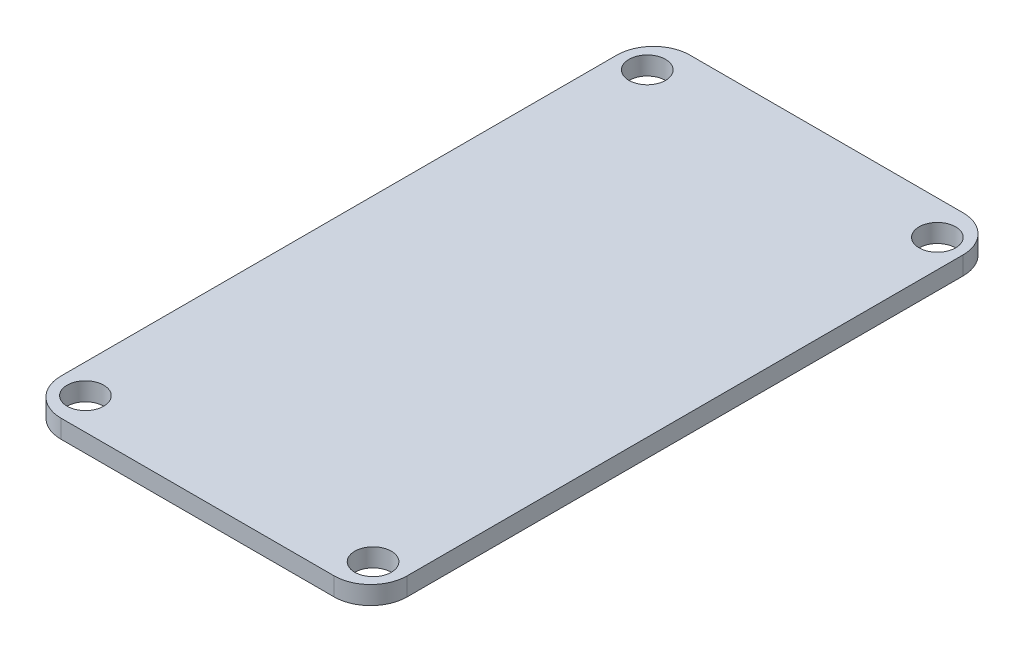
ISO-10303-21;
HEADER;
FILE_DESCRIPTION(('STEP AP214'),'2;1');
FILE_NAME('part.step','',(''),(''),'','','');
FILE_SCHEMA(('AUTOMOTIVE_DESIGN { 1 0 10303 214 1 1 1 1 }'));
ENDSEC;
DATA;
#1=APPLICATION_CONTEXT('core data for automotive mechanical design processes');
#2=APPLICATION_PROTOCOL_DEFINITION('international standard','automotive_design',2000,#1);
#3=PRODUCT_CONTEXT('',#1,'mechanical');
#4=PRODUCT('Part','Part','',(#3));
#5=PRODUCT_RELATED_PRODUCT_CATEGORY('part','',(#4));
#6=PRODUCT_DEFINITION_FORMATION('','',#4);
#7=PRODUCT_DEFINITION_CONTEXT('part definition',#1,'design');
#8=PRODUCT_DEFINITION('design','',#6,#7);
#9=PRODUCT_DEFINITION_SHAPE('','',#8);
#10=(LENGTH_UNIT() NAMED_UNIT(*) SI_UNIT(.MILLI.,.METRE.));
#11=(NAMED_UNIT(*) PLANE_ANGLE_UNIT() SI_UNIT($,.RADIAN.));
#12=(NAMED_UNIT(*) SI_UNIT($,.STERADIAN.) SOLID_ANGLE_UNIT());
#13=UNCERTAINTY_MEASURE_WITH_UNIT(LENGTH_MEASURE(1.E-05),#10,'distance_accuracy_value','');
#14=(GEOMETRIC_REPRESENTATION_CONTEXT(3) GLOBAL_UNCERTAINTY_ASSIGNED_CONTEXT((#13)) GLOBAL_UNIT_ASSIGNED_CONTEXT((#10,
#11,#12)) REPRESENTATION_CONTEXT('',''));
#15=CARTESIAN_POINT('',(0.,0.,0.));
#16=DIRECTION('',(0.,0.,1.));
#17=DIRECTION('',(1.,0.,0.));
#18=AXIS2_PLACEMENT_3D('',#15,#16,#17);
#19=CARTESIAN_POINT('',(-11.2,0.75,-22.8));
#20=DIRECTION('',(0.,-1.,0.));
#21=DIRECTION('',(0.,0.,-1.));
#22=AXIS2_PLACEMENT_3D('',#19,#20,#21);
#23=CYLINDRICAL_SURFACE('',#22,3.);
#24=CARTESIAN_POINT('',(-11.2,-0.75,-22.8));
#25=DIRECTION('',(0.,1.,0.));
#26=DIRECTION('',(0.,0.,1.));
#27=AXIS2_PLACEMENT_3D('',#24,#25,#26);
#28=CIRCLE('',#27,3.);
#29=CARTESIAN_POINT('',(-11.2,-0.75,-25.8));
#30=VERTEX_POINT('',#29);
#31=CARTESIAN_POINT('',(-14.2,-0.75,-22.8));
#32=VERTEX_POINT('',#31);
#33=EDGE_CURVE('E133',#30,#32,#28,.T.);
#34=ORIENTED_EDGE('',*,*,#33,.T.);
#35=DIRECTION('',(0.,-1.,0.));
#36=VECTOR('',#35,1.);
#37=CARTESIAN_POINT('',(-14.2,0.75,-22.8));
#38=LINE('',#37,#36);
#39=CARTESIAN_POINT('',(-14.2,0.75,-22.8));
#40=VERTEX_POINT('',#39);
#41=EDGE_CURVE('E11',#40,#32,#38,.T.);
#42=ORIENTED_EDGE('',*,*,#41,.F.);
#43=CARTESIAN_POINT('',(-11.2,0.75,-22.8));
#44=DIRECTION('',(0.,1.,0.));
#45=DIRECTION('',(0.,0.,1.));
#46=AXIS2_PLACEMENT_3D('',#43,#44,#45);
#47=CIRCLE('',#46,3.);
#48=CARTESIAN_POINT('',(-11.2,0.75,-25.8));
#49=VERTEX_POINT('',#48);
#50=EDGE_CURVE('E148',#49,#40,#47,.T.);
#51=ORIENTED_EDGE('',*,*,#50,.F.);
#52=DIRECTION('',(0.,-1.,0.));
#53=VECTOR('',#52,1.);
#54=CARTESIAN_POINT('',(-11.2,0.75,-25.8));
#55=LINE('',#54,#53);
#56=EDGE_CURVE('E129',#49,#30,#55,.T.);
#57=ORIENTED_EDGE('',*,*,#56,.T.);
#58=EDGE_LOOP('',(#34,#42,#51,#57));
#59=FACE_BOUND('',#58,.T.);
#60=ADVANCED_FACE('F37',(#59),#23,.T.);
#61=CARTESIAN_POINT('',(-14.2,0.75,-22.8));
#62=DIRECTION('',(1.,0.,0.));
#63=DIRECTION('',(0.,0.,-1.));
#64=AXIS2_PLACEMENT_3D('',#61,#62,#63);
#65=PLANE('',#64);
#66=DIRECTION('',(0.,0.,1.));
#67=VECTOR('',#66,1.);
#68=CARTESIAN_POINT('',(-14.2,-0.75,-22.8));
#69=LINE('',#68,#67);
#70=CARTESIAN_POINT('',(-14.2,-0.75,22.8));
#71=VERTEX_POINT('',#70);
#72=EDGE_CURVE('E136',#32,#71,#69,.T.);
#73=ORIENTED_EDGE('',*,*,#72,.T.);
#74=DIRECTION('',(0.,-1.,0.));
#75=VECTOR('',#74,1.);
#76=CARTESIAN_POINT('',(-14.2,0.75,22.8));
#77=LINE('',#76,#75);
#78=CARTESIAN_POINT('',(-14.2,0.75,22.8));
#79=VERTEX_POINT('',#78);
#80=EDGE_CURVE('E45',#79,#71,#77,.T.);
#81=ORIENTED_EDGE('',*,*,#80,.F.);
#82=DIRECTION('',(0.,0.,1.));
#83=VECTOR('',#82,1.);
#84=CARTESIAN_POINT('',(-14.2,0.75,-22.8));
#85=LINE('',#84,#83);
#86=EDGE_CURVE('E96',#40,#79,#85,.T.);
#87=ORIENTED_EDGE('',*,*,#86,.F.);
#88=ORIENTED_EDGE('',*,*,#41,.T.);
#89=EDGE_LOOP('',(#73,#81,#87,#88));
#90=FACE_BOUND('',#89,.T.);
#91=ADVANCED_FACE('F230',(#90),#65,.F.);
#92=CARTESIAN_POINT('',(-11.2,0.75,22.8));
#93=DIRECTION('',(0.,-1.,0.));
#94=DIRECTION('',(0.,0.,-1.));
#95=AXIS2_PLACEMENT_3D('',#92,#93,#94);
#96=CYLINDRICAL_SURFACE('',#95,3.);
#97=CARTESIAN_POINT('',(-11.2,-0.75,22.8));
#98=DIRECTION('',(0.,1.,0.));
#99=DIRECTION('',(0.,0.,1.));
#100=AXIS2_PLACEMENT_3D('',#97,#98,#99);
#101=CIRCLE('',#100,3.);
#102=CARTESIAN_POINT('',(-11.2,-0.75,25.8));
#103=VERTEX_POINT('',#102);
#104=EDGE_CURVE('E139',#71,#103,#101,.T.);
#105=ORIENTED_EDGE('',*,*,#104,.T.);
#106=DIRECTION('',(0.,-1.,0.));
#107=VECTOR('',#106,1.);
#108=CARTESIAN_POINT('',(-11.2,0.75,25.8));
#109=LINE('',#108,#107);
#110=CARTESIAN_POINT('',(-11.2,0.75,25.8));
#111=VERTEX_POINT('',#110);
#112=EDGE_CURVE('E155',#111,#103,#109,.T.);
#113=ORIENTED_EDGE('',*,*,#112,.F.);
#114=CARTESIAN_POINT('',(-11.2,0.75,22.8));
#115=DIRECTION('',(0.,1.,0.));
#116=DIRECTION('',(0.,0.,1.));
#117=AXIS2_PLACEMENT_3D('',#114,#115,#116);
#118=CIRCLE('',#117,3.);
#119=EDGE_CURVE('E163',#79,#111,#118,.T.);
#120=ORIENTED_EDGE('',*,*,#119,.F.);
#121=ORIENTED_EDGE('',*,*,#80,.T.);
#122=EDGE_LOOP('',(#105,#113,#120,#121));
#123=FACE_BOUND('',#122,.T.);
#124=ADVANCED_FACE('F161',(#123),#96,.T.);
#125=CARTESIAN_POINT('',(-11.2,0.75,25.8));
#126=DIRECTION('',(0.,0.,-1.));
#127=DIRECTION('',(-1.,0.,0.));
#128=AXIS2_PLACEMENT_3D('',#125,#126,#127);
#129=PLANE('',#128);
#130=DIRECTION('',(1.,0.,0.));
#131=VECTOR('',#130,1.);
#132=CARTESIAN_POINT('',(-11.2,-0.75,25.8));
#133=LINE('',#132,#131);
#134=CARTESIAN_POINT('',(11.2,-0.75,25.8));
#135=VERTEX_POINT('',#134);
#136=EDGE_CURVE('E141',#103,#135,#133,.T.);
#137=ORIENTED_EDGE('',*,*,#136,.T.);
#138=DIRECTION('',(0.,-1.,0.));
#139=VECTOR('',#138,1.);
#140=CARTESIAN_POINT('',(11.2,0.75,25.8));
#141=LINE('',#140,#139);
#142=CARTESIAN_POINT('',(11.2,0.75,25.8));
#143=VERTEX_POINT('',#142);
#144=EDGE_CURVE('E152',#143,#135,#141,.T.);
#145=ORIENTED_EDGE('',*,*,#144,.F.);
#146=DIRECTION('',(1.,0.,0.));
#147=VECTOR('',#146,1.);
#148=CARTESIAN_POINT('',(-11.2,0.75,25.8));
#149=LINE('',#148,#147);
#150=EDGE_CURVE('E175',#111,#143,#149,.T.);
#151=ORIENTED_EDGE('',*,*,#150,.F.);
#152=ORIENTED_EDGE('',*,*,#112,.T.);
#153=EDGE_LOOP('',(#137,#145,#151,#152));
#154=FACE_BOUND('',#153,.T.);
#155=ADVANCED_FACE('F171',(#154),#129,.F.);
#156=CARTESIAN_POINT('',(11.2,0.75,22.8));
#157=DIRECTION('',(0.,-1.,0.));
#158=DIRECTION('',(0.,0.,-1.));
#159=AXIS2_PLACEMENT_3D('',#156,#157,#158);
#160=CYLINDRICAL_SURFACE('',#159,3.);
#161=CARTESIAN_POINT('',(11.2,-0.75,22.8));
#162=DIRECTION('',(0.,1.,0.));
#163=DIRECTION('',(0.,0.,1.));
#164=AXIS2_PLACEMENT_3D('',#161,#162,#163);
#165=CIRCLE('',#164,3.);
#166=CARTESIAN_POINT('',(14.2,-0.75,22.8));
#167=VERTEX_POINT('',#166);
#168=EDGE_CURVE('E143',#135,#167,#165,.T.);
#169=ORIENTED_EDGE('',*,*,#168,.T.);
#170=DIRECTION('',(0.,-1.,0.));
#171=VECTOR('',#170,1.);
#172=CARTESIAN_POINT('',(14.2,0.75,22.8));
#173=LINE('',#172,#171);
#174=CARTESIAN_POINT('',(14.2,0.75,22.8));
#175=VERTEX_POINT('',#174);
#176=EDGE_CURVE('E124',#175,#167,#173,.T.);
#177=ORIENTED_EDGE('',*,*,#176,.F.);
#178=CARTESIAN_POINT('',(11.2,0.75,22.8));
#179=DIRECTION('',(0.,1.,0.));
#180=DIRECTION('',(0.,0.,1.));
#181=AXIS2_PLACEMENT_3D('',#178,#179,#180);
#182=CIRCLE('',#181,3.);
#183=EDGE_CURVE('E115',#143,#175,#182,.T.);
#184=ORIENTED_EDGE('',*,*,#183,.F.);
#185=ORIENTED_EDGE('',*,*,#144,.T.);
#186=EDGE_LOOP('',(#169,#177,#184,#185));
#187=FACE_BOUND('',#186,.T.);
#188=ADVANCED_FACE('F174',(#187),#160,.T.);
#189=CARTESIAN_POINT('',(14.2,0.75,-22.8));
#190=DIRECTION('',(-1.,0.,0.));
#191=DIRECTION('',(0.,0.,1.));
#192=AXIS2_PLACEMENT_3D('',#189,#190,#191);
#193=PLANE('',#192);
#194=DIRECTION('',(0.,0.,-1.));
#195=VECTOR('',#194,1.);
#196=CARTESIAN_POINT('',(14.2,-0.75,-22.8));
#197=LINE('',#196,#195);
#198=CARTESIAN_POINT('',(14.2,-0.75,-22.8));
#199=VERTEX_POINT('',#198);
#200=EDGE_CURVE('E123',#167,#199,#197,.T.);
#201=ORIENTED_EDGE('',*,*,#200,.T.);
#202=DIRECTION('',(0.,-1.,0.));
#203=VECTOR('',#202,1.);
#204=CARTESIAN_POINT('',(14.2,0.75,-22.8));
#205=LINE('',#204,#203);
#206=CARTESIAN_POINT('',(14.2,0.75,-22.8));
#207=VERTEX_POINT('',#206);
#208=EDGE_CURVE('E120',#207,#199,#205,.T.);
#209=ORIENTED_EDGE('',*,*,#208,.F.);
#210=DIRECTION('',(0.,0.,-1.));
#211=VECTOR('',#210,1.);
#212=CARTESIAN_POINT('',(14.2,0.75,-22.8));
#213=LINE('',#212,#211);
#214=EDGE_CURVE('E109',#175,#207,#213,.T.);
#215=ORIENTED_EDGE('',*,*,#214,.F.);
#216=ORIENTED_EDGE('',*,*,#176,.T.);
#217=EDGE_LOOP('',(#201,#209,#215,#216));
#218=FACE_BOUND('',#217,.T.);
#219=ADVANCED_FACE('F121',(#218),#193,.F.);
#220=CARTESIAN_POINT('',(11.2,0.75,-22.8));
#221=DIRECTION('',(0.,-1.,0.));
#222=DIRECTION('',(0.,0.,-1.));
#223=AXIS2_PLACEMENT_3D('',#220,#221,#222);
#224=CYLINDRICAL_SURFACE('',#223,3.);
#225=CARTESIAN_POINT('',(11.2,-0.75,-22.8));
#226=DIRECTION('',(0.,1.,0.));
#227=DIRECTION('',(0.,0.,-1.));
#228=AXIS2_PLACEMENT_3D('',#225,#226,#227);
#229=CIRCLE('',#228,3.);
#230=CARTESIAN_POINT('',(11.2,-0.75,-25.8));
#231=VERTEX_POINT('',#230);
#232=EDGE_CURVE('E82',#199,#231,#229,.T.);
#233=ORIENTED_EDGE('',*,*,#232,.T.);
#234=DIRECTION('',(0.,-1.,0.));
#235=VECTOR('',#234,1.);
#236=CARTESIAN_POINT('',(11.2,0.75,-25.8));
#237=LINE('',#236,#235);
#238=CARTESIAN_POINT('',(11.2,0.75,-25.8));
#239=VERTEX_POINT('',#238);
#240=EDGE_CURVE('E125',#239,#231,#237,.T.);
#241=ORIENTED_EDGE('',*,*,#240,.F.);
#242=CARTESIAN_POINT('',(11.2,0.75,-22.8));
#243=DIRECTION('',(0.,1.,0.));
#244=DIRECTION('',(0.,0.,-1.));
#245=AXIS2_PLACEMENT_3D('',#242,#243,#244);
#246=CIRCLE('',#245,3.);
#247=EDGE_CURVE('E113',#207,#239,#246,.T.);
#248=ORIENTED_EDGE('',*,*,#247,.F.);
#249=ORIENTED_EDGE('',*,*,#208,.T.);
#250=EDGE_LOOP('',(#233,#241,#248,#249));
#251=FACE_BOUND('',#250,.T.);
#252=ADVANCED_FACE('F127',(#251),#224,.T.);
#253=CARTESIAN_POINT('',(-11.2,0.75,-25.8));
#254=DIRECTION('',(0.,0.,1.));
#255=DIRECTION('',(1.,0.,0.));
#256=AXIS2_PLACEMENT_3D('',#253,#254,#255);
#257=PLANE('',#256);
#258=DIRECTION('',(-1.,0.,0.));
#259=VECTOR('',#258,1.);
#260=CARTESIAN_POINT('',(-11.2,-0.75,-25.8));
#261=LINE('',#260,#259);
#262=EDGE_CURVE('E88',#231,#30,#261,.T.);
#263=ORIENTED_EDGE('',*,*,#262,.T.);
#264=ORIENTED_EDGE('',*,*,#56,.F.);
#265=DIRECTION('',(-1.,0.,0.));
#266=VECTOR('',#265,1.);
#267=CARTESIAN_POINT('',(-11.2,0.75,-25.8));
#268=LINE('',#267,#266);
#269=EDGE_CURVE('E53',#239,#49,#268,.T.);
#270=ORIENTED_EDGE('',*,*,#269,.F.);
#271=ORIENTED_EDGE('',*,*,#240,.T.);
#272=EDGE_LOOP('',(#263,#264,#270,#271));
#273=FACE_BOUND('',#272,.T.);
#274=ADVANCED_FACE('F210',(#273),#257,.F.);
#275=CARTESIAN_POINT('',(-11.2,0.75,-22.8));
#276=DIRECTION('',(0.,1.,0.));
#277=DIRECTION('',(0.,0.,1.));
#278=AXIS2_PLACEMENT_3D('',#275,#276,#277);
#279=PLANE('',#278);
#280=CARTESIAN_POINT('',(-11.9,0.75,-23.));
#281=DIRECTION('',(0.,1.,0.));
#282=DIRECTION('',(0.,0.,-1.));
#283=AXIS2_PLACEMENT_3D('',#280,#281,#282);
#284=CIRCLE('',#283,1.5);
#285=CARTESIAN_POINT('',(-11.9,0.75,-24.5));
#286=VERTEX_POINT('',#285);
#287=EDGE_CURVE('E190',#286,#286,#284,.T.);
#288=ORIENTED_EDGE('',*,*,#287,.F.);
#289=EDGE_LOOP('',(#288));
#290=FACE_BOUND('',#289,.T.);
#291=CARTESIAN_POINT('',(11.8,0.75,23.2));
#292=DIRECTION('',(0.,1.,0.));
#293=DIRECTION('',(0.,0.,1.));
#294=AXIS2_PLACEMENT_3D('',#291,#292,#293);
#295=CIRCLE('',#294,1.5);
#296=CARTESIAN_POINT('',(11.8,0.75,24.7));
#297=VERTEX_POINT('',#296);
#298=EDGE_CURVE('E191',#297,#297,#295,.T.);
#299=ORIENTED_EDGE('',*,*,#298,.F.);
#300=EDGE_LOOP('',(#299));
#301=FACE_BOUND('',#300,.T.);
#302=CARTESIAN_POINT('',(-11.8,0.75,23.2));
#303=DIRECTION('',(0.,1.,0.));
#304=DIRECTION('',(0.,0.,-1.));
#305=AXIS2_PLACEMENT_3D('',#302,#303,#304);
#306=CIRCLE('',#305,1.5);
#307=CARTESIAN_POINT('',(-11.8,0.75,21.7));
#308=VERTEX_POINT('',#307);
#309=EDGE_CURVE('E201',#308,#308,#306,.T.);
#310=ORIENTED_EDGE('',*,*,#309,.F.);
#311=EDGE_LOOP('',(#310));
#312=FACE_BOUND('',#311,.T.);
#313=CARTESIAN_POINT('',(11.9,0.75,-23.));
#314=DIRECTION('',(0.,1.,0.));
#315=DIRECTION('',(0.,0.,1.));
#316=AXIS2_PLACEMENT_3D('',#313,#314,#315);
#317=CIRCLE('',#316,1.5);
#318=CARTESIAN_POINT('',(11.9,0.75,-21.5));
#319=VERTEX_POINT('',#318);
#320=EDGE_CURVE('E183',#319,#319,#317,.T.);
#321=ORIENTED_EDGE('',*,*,#320,.F.);
#322=EDGE_LOOP('',(#321));
#323=FACE_BOUND('',#322,.T.);
#324=ORIENTED_EDGE('',*,*,#50,.T.);
#325=ORIENTED_EDGE('',*,*,#86,.T.);
#326=ORIENTED_EDGE('',*,*,#119,.T.);
#327=ORIENTED_EDGE('',*,*,#150,.T.);
#328=ORIENTED_EDGE('',*,*,#183,.T.);
#329=ORIENTED_EDGE('',*,*,#214,.T.);
#330=ORIENTED_EDGE('',*,*,#247,.T.);
#331=ORIENTED_EDGE('',*,*,#269,.T.);
#332=EDGE_LOOP('',(#324,#325,#326,#327,#328,#329,#330,#331));
#333=FACE_BOUND('',#332,.T.);
#334=ADVANCED_FACE('F111',(#290,#301,#312,#323,#333),#279,.T.);
#335=CARTESIAN_POINT('',(-11.2,-0.75,-22.8));
#336=DIRECTION('',(0.,1.,0.));
#337=DIRECTION('',(0.,0.,1.));
#338=AXIS2_PLACEMENT_3D('',#335,#336,#337);
#339=PLANE('',#338);
#340=CARTESIAN_POINT('',(-11.9,-0.75,-23.));
#341=DIRECTION('',(0.,1.,0.));
#342=DIRECTION('',(0.,0.,1.));
#343=AXIS2_PLACEMENT_3D('',#340,#341,#342);
#344=CIRCLE('',#343,1.5);
#345=CARTESIAN_POINT('',(-11.9,-0.75,-21.5));
#346=VERTEX_POINT('',#345);
#347=EDGE_CURVE('E186',#346,#346,#344,.F.);
#348=ORIENTED_EDGE('',*,*,#347,.F.);
#349=EDGE_LOOP('',(#348));
#350=FACE_BOUND('',#349,.T.);
#351=CARTESIAN_POINT('',(11.8,-0.75,23.2));
#352=DIRECTION('',(0.,1.,0.));
#353=DIRECTION('',(0.,0.,1.));
#354=AXIS2_PLACEMENT_3D('',#351,#352,#353);
#355=CIRCLE('',#354,1.5);
#356=CARTESIAN_POINT('',(11.8,-0.75,24.7));
#357=VERTEX_POINT('',#356);
#358=EDGE_CURVE('E187',#357,#357,#355,.F.);
#359=ORIENTED_EDGE('',*,*,#358,.F.);
#360=EDGE_LOOP('',(#359));
#361=FACE_BOUND('',#360,.T.);
#362=CARTESIAN_POINT('',(-11.8,-0.75,23.2));
#363=DIRECTION('',(0.,1.,0.));
#364=DIRECTION('',(0.,0.,1.));
#365=AXIS2_PLACEMENT_3D('',#362,#363,#364);
#366=CIRCLE('',#365,1.5);
#367=CARTESIAN_POINT('',(-11.8,-0.75,24.7));
#368=VERTEX_POINT('',#367);
#369=EDGE_CURVE('E194',#368,#368,#366,.F.);
#370=ORIENTED_EDGE('',*,*,#369,.F.);
#371=EDGE_LOOP('',(#370));
#372=FACE_BOUND('',#371,.T.);
#373=CARTESIAN_POINT('',(11.9,-0.75,-23.));
#374=DIRECTION('',(0.,1.,0.));
#375=DIRECTION('',(0.,0.,1.));
#376=AXIS2_PLACEMENT_3D('',#373,#374,#375);
#377=CIRCLE('',#376,1.5);
#378=CARTESIAN_POINT('',(11.9,-0.75,-21.5));
#379=VERTEX_POINT('',#378);
#380=EDGE_CURVE('E137',#379,#379,#377,.F.);
#381=ORIENTED_EDGE('',*,*,#380,.F.);
#382=EDGE_LOOP('',(#381));
#383=FACE_BOUND('',#382,.T.);
#384=ORIENTED_EDGE('',*,*,#33,.F.);
#385=ORIENTED_EDGE('',*,*,#262,.F.);
#386=ORIENTED_EDGE('',*,*,#232,.F.);
#387=ORIENTED_EDGE('',*,*,#200,.F.);
#388=ORIENTED_EDGE('',*,*,#168,.F.);
#389=ORIENTED_EDGE('',*,*,#136,.F.);
#390=ORIENTED_EDGE('',*,*,#104,.F.);
#391=ORIENTED_EDGE('',*,*,#72,.F.);
#392=EDGE_LOOP('',(#384,#385,#386,#387,#388,#389,#390,#391));
#393=FACE_BOUND('',#392,.T.);
#394=ADVANCED_FACE('F167',(#350,#361,#372,#383,#393),#339,.F.);
#395=CARTESIAN_POINT('',(11.9,-0.751,-23.));
#396=DIRECTION('',(0.,1.,0.));
#397=DIRECTION('',(0.,0.,1.));
#398=AXIS2_PLACEMENT_3D('',#395,#396,#397);
#399=CYLINDRICAL_SURFACE('',#398,1.5);
#400=ORIENTED_EDGE('',*,*,#320,.T.);
#401=EDGE_LOOP('',(#400));
#402=FACE_BOUND('',#401,.T.);
#403=ORIENTED_EDGE('',*,*,#380,.T.);
#404=EDGE_LOOP('',(#403));
#405=FACE_BOUND('',#404,.T.);
#406=ADVANCED_FACE('F215',(#402,#405),#399,.F.);
#407=CARTESIAN_POINT('',(-11.8,-0.751,23.2));
#408=DIRECTION('',(0.,1.,0.));
#409=DIRECTION('',(0.,0.,1.));
#410=AXIS2_PLACEMENT_3D('',#407,#408,#409);
#411=CYLINDRICAL_SURFACE('',#410,1.5);
#412=ORIENTED_EDGE('',*,*,#309,.T.);
#413=EDGE_LOOP('',(#412));
#414=FACE_BOUND('',#413,.T.);
#415=ORIENTED_EDGE('',*,*,#369,.T.);
#416=EDGE_LOOP('',(#415));
#417=FACE_BOUND('',#416,.T.);
#418=ADVANCED_FACE('F205',(#414,#417),#411,.F.);
#419=CARTESIAN_POINT('',(11.8,-0.751,23.2));
#420=DIRECTION('',(0.,1.,0.));
#421=DIRECTION('',(0.,0.,1.));
#422=AXIS2_PLACEMENT_3D('',#419,#420,#421);
#423=CYLINDRICAL_SURFACE('',#422,1.5);
#424=ORIENTED_EDGE('',*,*,#298,.T.);
#425=EDGE_LOOP('',(#424));
#426=FACE_BOUND('',#425,.T.);
#427=ORIENTED_EDGE('',*,*,#358,.T.);
#428=EDGE_LOOP('',(#427));
#429=FACE_BOUND('',#428,.T.);
#430=ADVANCED_FACE('F299',(#426,#429),#423,.F.);
#431=CARTESIAN_POINT('',(-11.9,-0.751,-23.));
#432=DIRECTION('',(0.,1.,0.));
#433=DIRECTION('',(0.,0.,1.));
#434=AXIS2_PLACEMENT_3D('',#431,#432,#433);
#435=CYLINDRICAL_SURFACE('',#434,1.5);
#436=ORIENTED_EDGE('',*,*,#287,.T.);
#437=EDGE_LOOP('',(#436));
#438=FACE_BOUND('',#437,.T.);
#439=ORIENTED_EDGE('',*,*,#347,.T.);
#440=EDGE_LOOP('',(#439));
#441=FACE_BOUND('',#440,.T.);
#442=ADVANCED_FACE('F308',(#438,#441),#435,.F.);
#443=CLOSED_SHELL('',(#60,#91,#124,#155,#188,#219,#252,#274,#334,#394,#406,#418,#430,#442));
#444=MANIFOLD_SOLID_BREP('B2',#443);
#445=ADVANCED_BREP_SHAPE_REPRESENTATION('',(#18,#444),#14);
#446=SHAPE_DEFINITION_REPRESENTATION(#9,#445);
ENDSEC;
END-ISO-10303-21;
